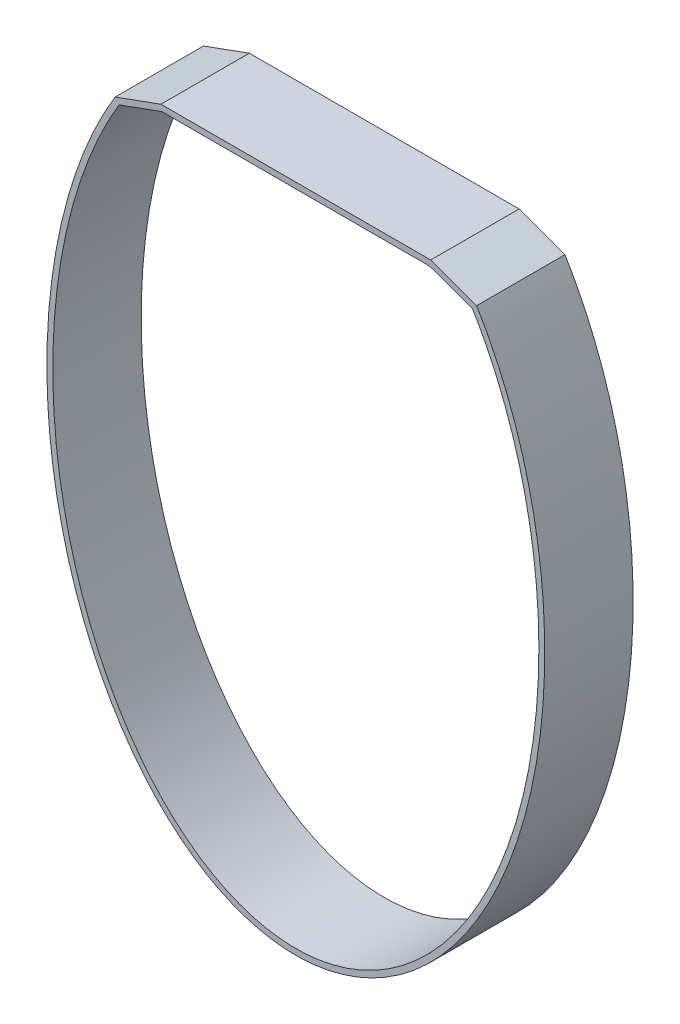
ISO-10303-21;
HEADER;
FILE_DESCRIPTION(('STEP AP214'),'2;1');
FILE_NAME('part.step','',(''),(''),'','','');
FILE_SCHEMA(('AUTOMOTIVE_DESIGN { 1 0 10303 214 1 1 1 1 }'));
ENDSEC;
DATA;
#1=APPLICATION_CONTEXT('core data for automotive mechanical design processes');
#2=APPLICATION_PROTOCOL_DEFINITION('international standard','automotive_design',2000,#1);
#3=PRODUCT_CONTEXT('',#1,'mechanical');
#4=PRODUCT('Part','Part','',(#3));
#5=PRODUCT_RELATED_PRODUCT_CATEGORY('part','',(#4));
#6=PRODUCT_DEFINITION_FORMATION('','',#4);
#7=PRODUCT_DEFINITION_CONTEXT('part definition',#1,'design');
#8=PRODUCT_DEFINITION('design','',#6,#7);
#9=PRODUCT_DEFINITION_SHAPE('','',#8);
#10=(LENGTH_UNIT() NAMED_UNIT(*) SI_UNIT(.MILLI.,.METRE.));
#11=(NAMED_UNIT(*) PLANE_ANGLE_UNIT() SI_UNIT($,.RADIAN.));
#12=(NAMED_UNIT(*) SI_UNIT($,.STERADIAN.) SOLID_ANGLE_UNIT());
#13=UNCERTAINTY_MEASURE_WITH_UNIT(LENGTH_MEASURE(1.E-05),#10,'distance_accuracy_value','');
#14=(GEOMETRIC_REPRESENTATION_CONTEXT(3) GLOBAL_UNCERTAINTY_ASSIGNED_CONTEXT((#13)) GLOBAL_UNIT_ASSIGNED_CONTEXT((#10,
#11,#12)) REPRESENTATION_CONTEXT('',''));
#15=CARTESIAN_POINT('',(0.,0.,0.));
#16=DIRECTION('',(0.,0.,1.));
#17=DIRECTION('',(1.,0.,0.));
#18=AXIS2_PLACEMENT_3D('',#15,#16,#17);
#19=CARTESIAN_POINT('',(1.42901230337754E-11,-225.30209828,15.));
#20=DIRECTION('',(0.,0.,-1.));
#21=DIRECTION('',(-1.,0.,0.));
#22=AXIS2_PLACEMENT_3D('',#19,#20,#21);
#23=PLANE('',#22);
#24=CARTESIAN_POINT('',(-61.3454744328553,-3.66345538125343,15.));
#25=CARTESIAN_POINT('',(-62.0545803301636,-4.82591593473847,15.));
#26=CARTESIAN_POINT('',(-63.4282081953869,-7.16202250131186,15.));
#27=CARTESIAN_POINT('',(-66.0806530200427,-12.0151942279194,15.));
#28=CARTESIAN_POINT('',(-69.1723153124946,-18.3434714486015,15.));
#29=CARTESIAN_POINT('',(-72.5183466817902,-26.3371018577029,15.));
#30=CARTESIAN_POINT('',(-76.4681503964756,-37.4650114395928,15.));
#31=CARTESIAN_POINT('',(-80.4104721213433,-52.1507787360858,15.));
#32=CARTESIAN_POINT('',(-83.4538179145018,-70.6473424380478,15.));
#33=CARTESIAN_POINT('',(-84.7485275515118,-89.6316432077269,15.));
#34=CARTESIAN_POINT('',(-84.1110666237203,-115.067059918031,15.));
#35=CARTESIAN_POINT('',(-78.8878633063439,-146.090783266245,15.));
#36=CARTESIAN_POINT('',(-66.0231865027781,-178.998173185197,15.));
#37=CARTESIAN_POINT('',(-47.5782753476066,-204.850142985468,15.));
#38=CARTESIAN_POINT('',(-24.9711073983826,-221.4574184212,15.));
#39=CARTESIAN_POINT('',(1.45716771982052E-11,-227.224438209403,15.));
#40=CARTESIAN_POINT('',(24.9711073984102,-221.457418421187,15.));
#41=CARTESIAN_POINT('',(47.5782753476304,-204.850142985443,15.));
#42=CARTESIAN_POINT('',(66.0231865027963,-178.998173185163,15.));
#43=CARTESIAN_POINT('',(78.887863306355,-146.090783266204,15.));
#44=CARTESIAN_POINT('',(84.1110666237248,-115.067059917987,15.));
#45=CARTESIAN_POINT('',(84.7485275515109,-89.6316432076831,15.));
#46=CARTESIAN_POINT('',(83.4538179144968,-70.6473424380047,15.));
#47=CARTESIAN_POINT('',(80.4104721213344,-52.1507787360442,15.));
#48=CARTESIAN_POINT('',(76.4681503964634,-37.4650114395532,15.));
#49=CARTESIAN_POINT('',(72.5183466817757,-26.3371018576653,15.));
#50=CARTESIAN_POINT('',(69.1723153124783,-18.3434714485657,15.));
#51=CARTESIAN_POINT('',(66.0806530200251,-12.0151942278852,15.));
#52=CARTESIAN_POINT('',(63.4282081953683,-7.16202250127903,15.));
#53=CARTESIAN_POINT('',(62.0545803301445,-4.82591593470637,15.));
#54=CARTESIAN_POINT('',(61.3454744328359,-3.66345538122169,15.));
#55=B_SPLINE_CURVE_WITH_KNOTS('',3,(#24,#25,#26,#27,#28,#29,#30,#31,#32,#33,#34,#35,#36,#37,#38,
#39,#40,#41,#42,#43,#44,#45,#46,#47,#48,#49,#50,#51,#52,#53,#54),.UNSPECIFIED.,.F.,.F.,(4,1,1,1,
1,1,1,1,1,1,1,1,1,1,1,1,1,1,1,1,1,1,1,1,1,1,1,1,4),(0.807969567692208,0.84443242840936,
0.880895289126512,0.953821010560817,1.02674673199512,1.09967245342943,1.24552389629804,
1.39137533916665,1.53722678203526,1.68307822490386,1.97478111064108,2.2664839963783,
2.55818688211552,2.84988976785274,3.14159265358996,3.43329553932718,3.7249984250644,
4.01670131080162,4.30840419653884,4.60010708227606,4.74595852514467,4.89180996801328,
5.03766141088188,5.18351285375049,5.2564385751848,5.3293642966191,5.40229001805341,
5.43875287877056,5.47521573948771),.UNSPECIFIED.);
#56=CARTESIAN_POINT('',(-61.3454744328553,-3.66345538125343,15.));
#57=VERTEX_POINT('',#56);
#58=CARTESIAN_POINT('',(61.3454744328359,-3.66345538122169,15.));
#59=VERTEX_POINT('',#58);
#60=EDGE_CURVE('E154',#57,#59,#55,.T.);
#61=ORIENTED_EDGE('',*,*,#60,.T.);
#62=DIRECTION('',(-0.939692620031067,0.342020145399578,0.));
#63=VECTOR('',#62,1.);
#64=CARTESIAN_POINT('',(45.7852587636924,2.,15.));
#65=LINE('',#64,#63);
#66=CARTESIAN_POINT('',(45.7852587636924,2.,15.));
#67=VERTEX_POINT('',#66);
#68=EDGE_CURVE('E161',#59,#67,#65,.T.);
#69=ORIENTED_EDGE('',*,*,#68,.T.);
#70=DIRECTION('',(-1.,0.,0.));
#71=VECTOR('',#70,1.);
#72=CARTESIAN_POINT('',(-45.7852587636924,2.,15.));
#73=LINE('',#72,#71);
#74=CARTESIAN_POINT('',(-45.7852587636924,2.,15.));
#75=VERTEX_POINT('',#74);
#76=EDGE_CURVE('E168',#67,#75,#73,.T.);
#77=ORIENTED_EDGE('',*,*,#76,.T.);
#78=DIRECTION('',(-0.939692620030588,-0.342020145400894,0.));
#79=VECTOR('',#78,1.);
#80=CARTESIAN_POINT('',(-45.7852587636924,2.,15.));
#81=LINE('',#80,#79);
#82=EDGE_CURVE('E171',#75,#57,#81,.T.);
#83=ORIENTED_EDGE('',*,*,#82,.T.);
#84=EDGE_LOOP('',(#61,#69,#77,#83));
#85=FACE_BOUND('',#84,.T.);
#86=CARTESIAN_POINT('',(0.,-94.0287072765509,15.));
#87=DIRECTION('',(0.,0.,1.));
#88=DIRECTION('',(0.,1.,0.));
#89=AXIS2_PLACEMENT_3D('',#86,#87,#88);
#90=ELLIPSE('',#89,129.273391003449,82.5);
#91=CARTESIAN_POINT('',(-60.,-5.30209828,15.));
#92=VERTEX_POINT('',#91);
#93=CARTESIAN_POINT('',(60.,-5.30209828,15.));
#94=VERTEX_POINT('',#93);
#95=EDGE_CURVE('E106',#92,#94,#90,.T.);
#96=ORIENTED_EDGE('',*,*,#95,.F.);
#97=DIRECTION('',(-0.939692620031105,-0.342020145399475,0.));
#98=VECTOR('',#97,1.);
#99=CARTESIAN_POINT('',(-45.4326048,0.,15.));
#100=LINE('',#99,#98);
#101=CARTESIAN_POINT('',(-45.4326048,0.,15.));
#102=VERTEX_POINT('',#101);
#103=EDGE_CURVE('E132',#102,#92,#100,.T.);
#104=ORIENTED_EDGE('',*,*,#103,.F.);
#105=DIRECTION('',(-1.,0.,0.));
#106=VECTOR('',#105,1.);
#107=CARTESIAN_POINT('',(-45.4326048,0.,15.));
#108=LINE('',#107,#106);
#109=CARTESIAN_POINT('',(45.4326048,0.,15.));
#110=VERTEX_POINT('',#109);
#111=EDGE_CURVE('E128',#110,#102,#108,.T.);
#112=ORIENTED_EDGE('',*,*,#111,.F.);
#113=DIRECTION('',(-0.939692620031105,0.342020145399475,0.));
#114=VECTOR('',#113,1.);
#115=CARTESIAN_POINT('',(45.4326048,0.,15.));
#116=LINE('',#115,#114);
#117=EDGE_CURVE('E115',#94,#110,#116,.T.);
#118=ORIENTED_EDGE('',*,*,#117,.F.);
#119=EDGE_LOOP('',(#96,#104,#112,#118));
#120=FACE_BOUND('',#119,.T.);
#121=ADVANCED_FACE('F39',(#85,#120),#23,.F.);
#122=CARTESIAN_POINT('',(1.42901230337754E-11,-225.30209828,-15.));
#123=DIRECTION('',(0.,0.,-1.));
#124=DIRECTION('',(-1.,0.,0.));
#125=AXIS2_PLACEMENT_3D('',#122,#123,#124);
#126=PLANE('',#125);
#127=CARTESIAN_POINT('',(-61.3454744328553,-3.66345538125343,-15.));
#128=CARTESIAN_POINT('',(-62.0545803301636,-4.82591593473847,-15.));
#129=CARTESIAN_POINT('',(-63.4282081953869,-7.16202250131186,-15.));
#130=CARTESIAN_POINT('',(-66.0806530200427,-12.0151942279194,-15.));
#131=CARTESIAN_POINT('',(-69.1723153124946,-18.3434714486015,-15.));
#132=CARTESIAN_POINT('',(-72.5183466817902,-26.3371018577029,-15.));
#133=CARTESIAN_POINT('',(-76.4681503964756,-37.4650114395928,-15.));
#134=CARTESIAN_POINT('',(-80.4104721213433,-52.1507787360858,-15.));
#135=CARTESIAN_POINT('',(-83.4538179145018,-70.6473424380478,-15.));
#136=CARTESIAN_POINT('',(-84.7485275515118,-89.6316432077269,-15.));
#137=CARTESIAN_POINT('',(-84.1110666237203,-115.067059918031,-15.));
#138=CARTESIAN_POINT('',(-78.8878633063439,-146.090783266245,-15.));
#139=CARTESIAN_POINT('',(-66.0231865027781,-178.998173185197,-15.));
#140=CARTESIAN_POINT('',(-47.5782753476066,-204.850142985468,-15.));
#141=CARTESIAN_POINT('',(-24.9711073983826,-221.4574184212,-15.));
#142=CARTESIAN_POINT('',(1.45716771982052E-11,-227.224438209403,-15.));
#143=CARTESIAN_POINT('',(24.9711073984102,-221.457418421187,-15.));
#144=CARTESIAN_POINT('',(47.5782753476304,-204.850142985443,-15.));
#145=CARTESIAN_POINT('',(66.0231865027963,-178.998173185163,-15.));
#146=CARTESIAN_POINT('',(78.887863306355,-146.090783266204,-15.));
#147=CARTESIAN_POINT('',(84.1110666237248,-115.067059917987,-15.));
#148=CARTESIAN_POINT('',(84.7485275515109,-89.6316432076831,-15.));
#149=CARTESIAN_POINT('',(83.4538179144968,-70.6473424380047,-15.));
#150=CARTESIAN_POINT('',(80.4104721213344,-52.1507787360442,-15.));
#151=CARTESIAN_POINT('',(76.4681503964634,-37.4650114395532,-15.));
#152=CARTESIAN_POINT('',(72.5183466817757,-26.3371018576653,-15.));
#153=CARTESIAN_POINT('',(69.1723153124783,-18.3434714485657,-15.));
#154=CARTESIAN_POINT('',(66.0806530200251,-12.0151942278852,-15.));
#155=CARTESIAN_POINT('',(63.4282081953683,-7.16202250127903,-15.));
#156=CARTESIAN_POINT('',(62.0545803301445,-4.82591593470637,-15.));
#157=CARTESIAN_POINT('',(61.3454744328359,-3.66345538122169,-15.));
#158=B_SPLINE_CURVE_WITH_KNOTS('',3,(#127,#128,#129,#130,#131,#132,#133,#134,#135,#136,#137,
#138,#139,#140,#141,#142,#143,#144,#145,#146,#147,#148,#149,#150,#151,#152,#153,#154,#155,#156,
#157),.UNSPECIFIED.,.F.,.F.,(4,1,1,1,1,1,1,1,1,1,1,1,1,1,1,1,1,1,1,1,1,1,1,1,1,1,1,1,4),
(0.807969567692208,0.84443242840936,0.880895289126512,0.953821010560817,1.02674673199512,
1.09967245342943,1.24552389629804,1.39137533916665,1.53722678203526,1.68307822490386,
1.97478111064108,2.2664839963783,2.55818688211552,2.84988976785274,3.14159265358996,
3.43329553932718,3.7249984250644,4.01670131080162,4.30840419653884,4.60010708227606,
4.74595852514467,4.89180996801328,5.03766141088188,5.18351285375049,5.2564385751848,
5.3293642966191,5.40229001805341,5.43875287877056,5.47521573948771),.UNSPECIFIED.);
#159=CARTESIAN_POINT('',(-61.3454744328553,-3.66345538125343,-15.));
#160=VERTEX_POINT('',#159);
#161=CARTESIAN_POINT('',(61.3454744328359,-3.66345538122169,-15.));
#162=VERTEX_POINT('',#161);
#163=EDGE_CURVE('E124',#160,#162,#158,.T.);
#164=ORIENTED_EDGE('',*,*,#163,.F.);
#165=DIRECTION('',(-0.939692620030588,-0.342020145400894,0.));
#166=VECTOR('',#165,1.);
#167=CARTESIAN_POINT('',(-45.7852587636924,2.,-15.));
#168=LINE('',#167,#166);
#169=CARTESIAN_POINT('',(-45.7852587636924,2.,-15.));
#170=VERTEX_POINT('',#169);
#171=EDGE_CURVE('E162',#170,#160,#168,.T.);
#172=ORIENTED_EDGE('',*,*,#171,.F.);
#173=DIRECTION('',(-1.,0.,0.));
#174=VECTOR('',#173,1.);
#175=CARTESIAN_POINT('',(-45.7852587636924,2.,-15.));
#176=LINE('',#175,#174);
#177=CARTESIAN_POINT('',(45.7852587636924,2.,-15.));
#178=VERTEX_POINT('',#177);
#179=EDGE_CURVE('E186',#178,#170,#176,.T.);
#180=ORIENTED_EDGE('',*,*,#179,.F.);
#181=DIRECTION('',(-0.939692620031067,0.342020145399578,0.));
#182=VECTOR('',#181,1.);
#183=CARTESIAN_POINT('',(45.7852587636924,2.,-15.));
#184=LINE('',#183,#182);
#185=EDGE_CURVE('E180',#162,#178,#184,.T.);
#186=ORIENTED_EDGE('',*,*,#185,.F.);
#187=EDGE_LOOP('',(#164,#172,#180,#186));
#188=FACE_BOUND('',#187,.T.);
#189=DIRECTION('',(-0.939692620031105,-0.342020145399475,0.));
#190=VECTOR('',#189,1.);
#191=CARTESIAN_POINT('',(-45.4326048,0.,-15.));
#192=LINE('',#191,#190);
#193=CARTESIAN_POINT('',(-45.4326048,0.,-15.));
#194=VERTEX_POINT('',#193);
#195=CARTESIAN_POINT('',(-60.,-5.30209827999998,-15.));
#196=VERTEX_POINT('',#195);
#197=EDGE_CURVE('E116',#194,#196,#192,.T.);
#198=ORIENTED_EDGE('',*,*,#197,.T.);
#199=CARTESIAN_POINT('',(0.,-94.0287072765509,-15.));
#200=DIRECTION('',(0.,0.,1.));
#201=DIRECTION('',(0.,1.,0.));
#202=AXIS2_PLACEMENT_3D('',#199,#200,#201);
#203=ELLIPSE('',#202,129.273391003449,82.5);
#204=CARTESIAN_POINT('',(60.,-5.30209828,-15.));
#205=VERTEX_POINT('',#204);
#206=EDGE_CURVE('E64',#196,#205,#203,.T.);
#207=ORIENTED_EDGE('',*,*,#206,.T.);
#208=DIRECTION('',(-0.939692620031105,0.342020145399475,0.));
#209=VECTOR('',#208,1.);
#210=CARTESIAN_POINT('',(45.4326048,0.,-15.));
#211=LINE('',#210,#209);
#212=CARTESIAN_POINT('',(45.4326048,0.,-15.));
#213=VERTEX_POINT('',#212);
#214=EDGE_CURVE('E122',#205,#213,#211,.T.);
#215=ORIENTED_EDGE('',*,*,#214,.T.);
#216=DIRECTION('',(-1.,0.,0.));
#217=VECTOR('',#216,1.);
#218=CARTESIAN_POINT('',(-45.4326048,0.,-15.));
#219=LINE('',#218,#217);
#220=EDGE_CURVE('E142',#213,#194,#219,.T.);
#221=ORIENTED_EDGE('',*,*,#220,.T.);
#222=EDGE_LOOP('',(#198,#207,#215,#221));
#223=FACE_BOUND('',#222,.T.);
#224=ADVANCED_FACE('F209',(#188,#223),#126,.T.);
#225=DIRECTION('',(0.,0.,-1.));
#226=VECTOR('',#225,1.);
#227=SURFACE_OF_LINEAR_EXTRUSION('',#55,#226);
#228=ORIENTED_EDGE('',*,*,#163,.T.);
#229=DIRECTION('',(0.,0.,-1.));
#230=VECTOR('',#229,1.);
#231=CARTESIAN_POINT('',(61.3454744328359,-3.66345538122169,15.));
#232=LINE('',#231,#230);
#233=EDGE_CURVE('E11',#59,#162,#232,.T.);
#234=ORIENTED_EDGE('',*,*,#233,.F.);
#235=ORIENTED_EDGE('',*,*,#60,.F.);
#236=DIRECTION('',(0.,0.,-1.));
#237=VECTOR('',#236,1.);
#238=CARTESIAN_POINT('',(-61.3454744328553,-3.66345538125343,15.));
#239=LINE('',#238,#237);
#240=EDGE_CURVE('E174',#57,#160,#239,.T.);
#241=ORIENTED_EDGE('',*,*,#240,.T.);
#242=EDGE_LOOP('',(#228,#234,#235,#241));
#243=FACE_BOUND('',#242,.T.);
#244=ADVANCED_FACE('F41',(#243),#227,.F.);
#245=CARTESIAN_POINT('',(45.7852587636924,2.,15.));
#246=DIRECTION('',(-0.342020145399578,-0.939692620031067,0.));
#247=DIRECTION('',(0.939692620031067,-0.342020145399578,0.));
#248=AXIS2_PLACEMENT_3D('',#245,#246,#247);
#249=PLANE('',#248);
#250=ORIENTED_EDGE('',*,*,#185,.T.);
#251=DIRECTION('',(0.,0.,-1.));
#252=VECTOR('',#251,1.);
#253=CARTESIAN_POINT('',(45.7852587636924,2.,15.));
#254=LINE('',#253,#252);
#255=EDGE_CURVE('E49',#67,#178,#254,.T.);
#256=ORIENTED_EDGE('',*,*,#255,.F.);
#257=ORIENTED_EDGE('',*,*,#68,.F.);
#258=ORIENTED_EDGE('',*,*,#233,.T.);
#259=EDGE_LOOP('',(#250,#256,#257,#258));
#260=FACE_BOUND('',#259,.T.);
#261=ADVANCED_FACE('F219',(#260),#249,.F.);
#262=CARTESIAN_POINT('',(-45.7852587636924,2.,15.));
#263=DIRECTION('',(0.,-1.,0.));
#264=DIRECTION('',(0.,0.,-1.));
#265=AXIS2_PLACEMENT_3D('',#262,#263,#264);
#266=PLANE('',#265);
#267=ORIENTED_EDGE('',*,*,#179,.T.);
#268=DIRECTION('',(0.,0.,-1.));
#269=VECTOR('',#268,1.);
#270=CARTESIAN_POINT('',(-45.7852587636924,2.,15.));
#271=LINE('',#270,#269);
#272=EDGE_CURVE('E194',#75,#170,#271,.T.);
#273=ORIENTED_EDGE('',*,*,#272,.F.);
#274=ORIENTED_EDGE('',*,*,#76,.F.);
#275=ORIENTED_EDGE('',*,*,#255,.T.);
#276=EDGE_LOOP('',(#267,#273,#274,#275));
#277=FACE_BOUND('',#276,.T.);
#278=ADVANCED_FACE('F203',(#277),#266,.F.);
#279=CARTESIAN_POINT('',(-45.7852587636924,2.,15.));
#280=DIRECTION('',(0.342020145400894,-0.939692620030588,0.));
#281=DIRECTION('',(0.939692620030588,0.342020145400894,0.));
#282=AXIS2_PLACEMENT_3D('',#279,#280,#281);
#283=PLANE('',#282);
#284=ORIENTED_EDGE('',*,*,#171,.T.);
#285=ORIENTED_EDGE('',*,*,#240,.F.);
#286=ORIENTED_EDGE('',*,*,#82,.F.);
#287=ORIENTED_EDGE('',*,*,#272,.T.);
#288=EDGE_LOOP('',(#284,#285,#286,#287));
#289=FACE_BOUND('',#288,.T.);
#290=ADVANCED_FACE('F213',(#289),#283,.F.);
#291=DIRECTION('',(0.,0.,-1.));
#292=VECTOR('',#291,1.);
#293=SURFACE_OF_LINEAR_EXTRUSION('',#90,#292);
#294=ORIENTED_EDGE('',*,*,#206,.F.);
#295=DIRECTION('',(0.,0.,-1.));
#296=VECTOR('',#295,1.);
#297=CARTESIAN_POINT('',(-60.,-5.30209828,15.));
#298=LINE('',#297,#296);
#299=EDGE_CURVE('E110',#92,#196,#298,.T.);
#300=ORIENTED_EDGE('',*,*,#299,.F.);
#301=ORIENTED_EDGE('',*,*,#95,.T.);
#302=DIRECTION('',(0.,0.,-1.));
#303=VECTOR('',#302,1.);
#304=CARTESIAN_POINT('',(60.,-5.30209828,15.));
#305=LINE('',#304,#303);
#306=EDGE_CURVE('E109',#94,#205,#305,.T.);
#307=ORIENTED_EDGE('',*,*,#306,.T.);
#308=EDGE_LOOP('',(#294,#300,#301,#307));
#309=FACE_BOUND('',#308,.T.);
#310=ADVANCED_FACE('F108',(#309),#293,.T.);
#311=CARTESIAN_POINT('',(45.4326048,0.,15.));
#312=DIRECTION('',(-0.342020145399475,-0.939692620031105,0.));
#313=DIRECTION('',(0.939692620031105,-0.342020145399475,0.));
#314=AXIS2_PLACEMENT_3D('',#311,#312,#313);
#315=PLANE('',#314);
#316=ORIENTED_EDGE('',*,*,#214,.F.);
#317=ORIENTED_EDGE('',*,*,#306,.F.);
#318=ORIENTED_EDGE('',*,*,#117,.T.);
#319=DIRECTION('',(0.,0.,-1.));
#320=VECTOR('',#319,1.);
#321=CARTESIAN_POINT('',(45.4326048,0.,15.));
#322=LINE('',#321,#320);
#323=EDGE_CURVE('E125',#110,#213,#322,.T.);
#324=ORIENTED_EDGE('',*,*,#323,.T.);
#325=EDGE_LOOP('',(#316,#317,#318,#324));
#326=FACE_BOUND('',#325,.T.);
#327=ADVANCED_FACE('F119',(#326),#315,.T.);
#328=CARTESIAN_POINT('',(-45.4326048,0.,15.));
#329=DIRECTION('',(0.,-1.,0.));
#330=DIRECTION('',(0.,0.,-1.));
#331=AXIS2_PLACEMENT_3D('',#328,#329,#330);
#332=PLANE('',#331);
#333=ORIENTED_EDGE('',*,*,#220,.F.);
#334=ORIENTED_EDGE('',*,*,#323,.F.);
#335=ORIENTED_EDGE('',*,*,#111,.T.);
#336=DIRECTION('',(0.,0.,-1.));
#337=VECTOR('',#336,1.);
#338=CARTESIAN_POINT('',(-45.4326048,0.,15.));
#339=LINE('',#338,#337);
#340=EDGE_CURVE('E56',#102,#194,#339,.T.);
#341=ORIENTED_EDGE('',*,*,#340,.T.);
#342=EDGE_LOOP('',(#333,#334,#335,#341));
#343=FACE_BOUND('',#342,.T.);
#344=ADVANCED_FACE('F242',(#343),#332,.T.);
#345=CARTESIAN_POINT('',(-45.4326048,0.,15.));
#346=DIRECTION('',(0.342020145399475,-0.939692620031105,0.));
#347=DIRECTION('',(0.939692620031105,0.342020145399475,0.));
#348=AXIS2_PLACEMENT_3D('',#345,#346,#347);
#349=PLANE('',#348);
#350=ORIENTED_EDGE('',*,*,#197,.F.);
#351=ORIENTED_EDGE('',*,*,#340,.F.);
#352=ORIENTED_EDGE('',*,*,#103,.T.);
#353=ORIENTED_EDGE('',*,*,#299,.T.);
#354=EDGE_LOOP('',(#350,#351,#352,#353));
#355=FACE_BOUND('',#354,.T.);
#356=ADVANCED_FACE('F246',(#355),#349,.T.);
#357=CLOSED_SHELL('',(#121,#224,#244,#261,#278,#290,#310,#327,#344,#356));
#358=MANIFOLD_SOLID_BREP('B2',#357);
#359=ADVANCED_BREP_SHAPE_REPRESENTATION('',(#18,#358),#14);
#360=SHAPE_DEFINITION_REPRESENTATION(#9,#359);
ENDSEC;
END-ISO-10303-21;
